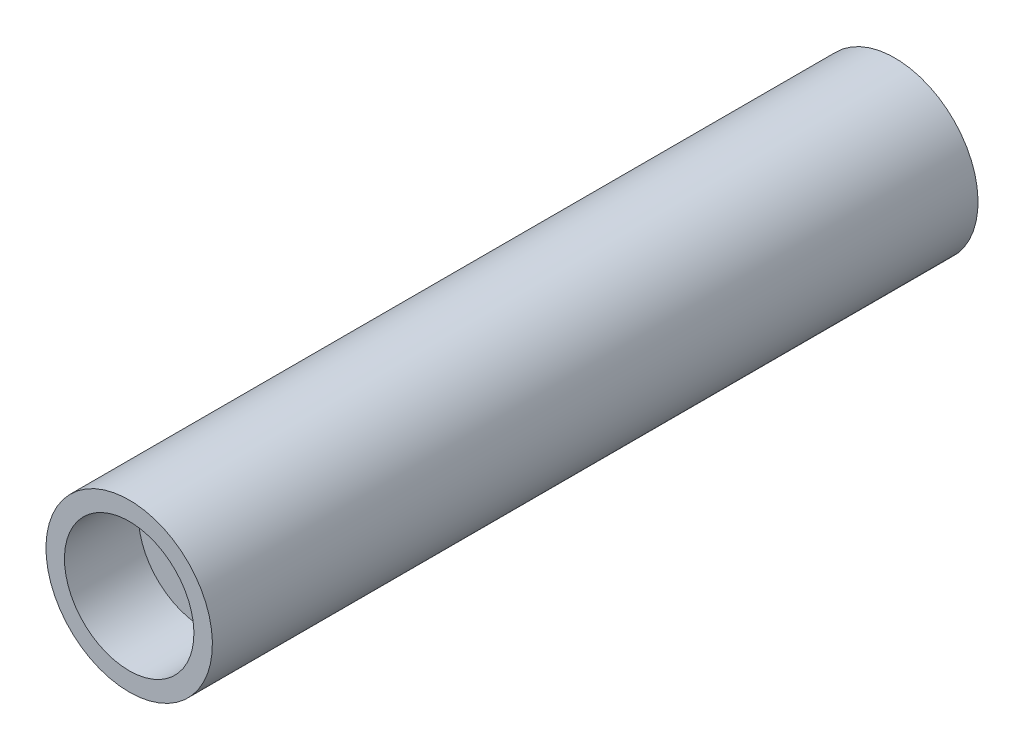
ISO-10303-21;
HEADER;
FILE_DESCRIPTION(('STEP AP214'),'2;1');
FILE_NAME('part.step','',(''),(''),'','','');
FILE_SCHEMA(('AUTOMOTIVE_DESIGN { 1 0 10303 214 1 1 1 1 }'));
ENDSEC;
DATA;
#1=APPLICATION_CONTEXT('core data for automotive mechanical design processes');
#2=APPLICATION_PROTOCOL_DEFINITION('international standard','automotive_design',2000,#1);
#3=PRODUCT_CONTEXT('',#1,'mechanical');
#4=PRODUCT('Part','Part','',(#3));
#5=PRODUCT_RELATED_PRODUCT_CATEGORY('part','',(#4));
#6=PRODUCT_DEFINITION_FORMATION('','',#4);
#7=PRODUCT_DEFINITION_CONTEXT('part definition',#1,'design');
#8=PRODUCT_DEFINITION('design','',#6,#7);
#9=PRODUCT_DEFINITION_SHAPE('','',#8);
#10=(LENGTH_UNIT() NAMED_UNIT(*) SI_UNIT(.MILLI.,.METRE.));
#11=(NAMED_UNIT(*) PLANE_ANGLE_UNIT() SI_UNIT($,.RADIAN.));
#12=(NAMED_UNIT(*) SI_UNIT($,.STERADIAN.) SOLID_ANGLE_UNIT());
#13=UNCERTAINTY_MEASURE_WITH_UNIT(LENGTH_MEASURE(1.E-05),#10,'distance_accuracy_value','');
#14=(GEOMETRIC_REPRESENTATION_CONTEXT(3) GLOBAL_UNCERTAINTY_ASSIGNED_CONTEXT((#13)) GLOBAL_UNIT_ASSIGNED_CONTEXT((#10,
#11,#12)) REPRESENTATION_CONTEXT('',''));
#15=CARTESIAN_POINT('',(0.,0.,0.));
#16=DIRECTION('',(0.,0.,1.));
#17=DIRECTION('',(1.,0.,0.));
#18=AXIS2_PLACEMENT_3D('',#15,#16,#17);
#19=CARTESIAN_POINT('',(0.,4.5,-20.7));
#20=DIRECTION('',(0.,0.,1.));
#21=DIRECTION('',(0.,-1.,0.));
#22=AXIS2_PLACEMENT_3D('',#19,#20,#21);
#23=PLANE('',#22);
#24=CARTESIAN_POINT('',(0.,0.,-20.7));
#25=DIRECTION('',(0.,0.,1.));
#26=DIRECTION('',(0.,-1.,0.));
#27=AXIS2_PLACEMENT_3D('',#24,#25,#26);
#28=CIRCLE('',#27,4.5);
#29=CARTESIAN_POINT('',(0.,-4.49999999999999,-20.7));
#30=VERTEX_POINT('',#29);
#31=EDGE_CURVE('E10',#30,#30,#28,.T.);
#32=ORIENTED_EDGE('',*,*,#31,.F.);
#33=EDGE_LOOP('',(#32));
#34=FACE_BOUND('',#33,.T.);
#35=CARTESIAN_POINT('',(0.,0.,-20.7));
#36=DIRECTION('',(0.,0.,1.));
#37=DIRECTION('',(0.,-1.,0.));
#38=AXIS2_PLACEMENT_3D('',#35,#36,#37);
#39=CIRCLE('',#38,3.49999999999999);
#40=CARTESIAN_POINT('',(0.,-3.49999999999999,-20.7));
#41=VERTEX_POINT('',#40);
#42=EDGE_CURVE('E58',#41,#41,#39,.T.);
#43=ORIENTED_EDGE('',*,*,#42,.T.);
#44=EDGE_LOOP('',(#43));
#45=FACE_BOUND('',#44,.T.);
#46=ADVANCED_FACE('F30',(#34,#45),#23,.F.);
#47=CARTESIAN_POINT('',(0.,0.,16.9300479337721));
#48=DIRECTION('',(0.,0.,1.));
#49=DIRECTION('',(0.,-1.,0.));
#50=AXIS2_PLACEMENT_3D('',#47,#48,#49);
#51=CYLINDRICAL_SURFACE('',#50,4.5);
#52=CARTESIAN_POINT('',(0.,0.,20.7));
#53=DIRECTION('',(0.,0.,1.));
#54=DIRECTION('',(0.,-1.,0.));
#55=AXIS2_PLACEMENT_3D('',#52,#53,#54);
#56=CIRCLE('',#55,4.5);
#57=CARTESIAN_POINT('',(0.,-4.5,20.7));
#58=VERTEX_POINT('',#57);
#59=EDGE_CURVE('E36',#58,#58,#56,.T.);
#60=ORIENTED_EDGE('',*,*,#59,.F.);
#61=EDGE_LOOP('',(#60));
#62=FACE_BOUND('',#61,.T.);
#63=ORIENTED_EDGE('',*,*,#31,.T.);
#64=EDGE_LOOP('',(#63));
#65=FACE_BOUND('',#64,.T.);
#66=ADVANCED_FACE('F95',(#62,#65),#51,.T.);
#67=CARTESIAN_POINT('',(0.,4.5,20.7));
#68=DIRECTION('',(0.,0.,-1.));
#69=DIRECTION('',(0.,1.,0.));
#70=AXIS2_PLACEMENT_3D('',#67,#68,#69);
#71=PLANE('',#70);
#72=CARTESIAN_POINT('',(0.,0.,20.7));
#73=DIRECTION('',(0.,0.,1.));
#74=DIRECTION('',(0.,-1.,0.));
#75=AXIS2_PLACEMENT_3D('',#72,#73,#74);
#76=CIRCLE('',#75,3.5);
#77=CARTESIAN_POINT('',(0.,-3.5,20.7));
#78=VERTEX_POINT('',#77);
#79=EDGE_CURVE('E40',#78,#78,#76,.T.);
#80=ORIENTED_EDGE('',*,*,#79,.F.);
#81=EDGE_LOOP('',(#80));
#82=FACE_BOUND('',#81,.T.);
#83=ORIENTED_EDGE('',*,*,#59,.T.);
#84=EDGE_LOOP('',(#83));
#85=FACE_BOUND('',#84,.T.);
#86=ADVANCED_FACE('F90',(#82,#85),#71,.F.);
#87=CARTESIAN_POINT('',(0.,0.,16.9300479337721));
#88=DIRECTION('',(0.,0.,1.));
#89=DIRECTION('',(0.,-1.,0.));
#90=AXIS2_PLACEMENT_3D('',#87,#88,#89);
#91=CYLINDRICAL_SURFACE('',#90,3.5);
#92=CARTESIAN_POINT('',(0.,0.,16.7));
#93=DIRECTION('',(0.,0.,1.));
#94=DIRECTION('',(0.,-1.,0.));
#95=AXIS2_PLACEMENT_3D('',#92,#93,#94);
#96=CIRCLE('',#95,3.5);
#97=CARTESIAN_POINT('',(0.,-3.5,16.7));
#98=VERTEX_POINT('',#97);
#99=EDGE_CURVE('E44',#98,#98,#96,.T.);
#100=ORIENTED_EDGE('',*,*,#99,.F.);
#101=EDGE_LOOP('',(#100));
#102=FACE_BOUND('',#101,.T.);
#103=ORIENTED_EDGE('',*,*,#79,.T.);
#104=EDGE_LOOP('',(#103));
#105=FACE_BOUND('',#104,.T.);
#106=ADVANCED_FACE('F84',(#102,#105),#91,.F.);
#107=CARTESIAN_POINT('',(0.,3.5,16.7));
#108=DIRECTION('',(0.,0.,-1.));
#109=DIRECTION('',(0.,1.,0.));
#110=AXIS2_PLACEMENT_3D('',#107,#108,#109);
#111=PLANE('',#110);
#112=CARTESIAN_POINT('',(0.,0.,16.7));
#113=DIRECTION('',(0.,0.,1.));
#114=DIRECTION('',(0.,-1.,0.));
#115=AXIS2_PLACEMENT_3D('',#112,#113,#114);
#116=CIRCLE('',#115,2.);
#117=CARTESIAN_POINT('',(0.,-2.,16.7));
#118=VERTEX_POINT('',#117);
#119=EDGE_CURVE('E49',#118,#118,#116,.T.);
#120=ORIENTED_EDGE('',*,*,#119,.F.);
#121=EDGE_LOOP('',(#120));
#122=FACE_BOUND('',#121,.T.);
#123=ORIENTED_EDGE('',*,*,#99,.T.);
#124=EDGE_LOOP('',(#123));
#125=FACE_BOUND('',#124,.T.);
#126=ADVANCED_FACE('F78',(#122,#125),#111,.F.);
#127=CARTESIAN_POINT('',(0.,0.,16.9300479337721));
#128=DIRECTION('',(0.,0.,1.));
#129=DIRECTION('',(0.,-1.,0.));
#130=AXIS2_PLACEMENT_3D('',#127,#128,#129);
#131=CYLINDRICAL_SURFACE('',#130,2.);
#132=CARTESIAN_POINT('',(0.,0.,-16.7));
#133=DIRECTION('',(0.,0.,1.));
#134=DIRECTION('',(0.,-1.,0.));
#135=AXIS2_PLACEMENT_3D('',#132,#133,#134);
#136=CIRCLE('',#135,1.99999999999999);
#137=CARTESIAN_POINT('',(0.,-1.99999999999999,-16.7));
#138=VERTEX_POINT('',#137);
#139=EDGE_CURVE('E52',#138,#138,#136,.T.);
#140=ORIENTED_EDGE('',*,*,#139,.F.);
#141=EDGE_LOOP('',(#140));
#142=FACE_BOUND('',#141,.T.);
#143=ORIENTED_EDGE('',*,*,#119,.T.);
#144=EDGE_LOOP('',(#143));
#145=FACE_BOUND('',#144,.T.);
#146=ADVANCED_FACE('F72',(#142,#145),#131,.F.);
#147=CARTESIAN_POINT('',(0.,3.5,-16.7));
#148=DIRECTION('',(0.,0.,1.));
#149=DIRECTION('',(0.,-1.,0.));
#150=AXIS2_PLACEMENT_3D('',#147,#148,#149);
#151=PLANE('',#150);
#152=CARTESIAN_POINT('',(0.,0.,-16.7));
#153=DIRECTION('',(0.,0.,1.));
#154=DIRECTION('',(0.,-1.,0.));
#155=AXIS2_PLACEMENT_3D('',#152,#153,#154);
#156=CIRCLE('',#155,3.5);
#157=CARTESIAN_POINT('',(0.,-3.49999999999999,-16.7));
#158=VERTEX_POINT('',#157);
#159=EDGE_CURVE('E55',#158,#158,#156,.T.);
#160=ORIENTED_EDGE('',*,*,#159,.F.);
#161=EDGE_LOOP('',(#160));
#162=FACE_BOUND('',#161,.T.);
#163=ORIENTED_EDGE('',*,*,#139,.T.);
#164=EDGE_LOOP('',(#163));
#165=FACE_BOUND('',#164,.T.);
#166=ADVANCED_FACE('F66',(#162,#165),#151,.F.);
#167=CARTESIAN_POINT('',(0.,0.,16.9300479337721));
#168=DIRECTION('',(0.,0.,1.));
#169=DIRECTION('',(0.,-1.,0.));
#170=AXIS2_PLACEMENT_3D('',#167,#168,#169);
#171=CYLINDRICAL_SURFACE('',#170,3.5);
#172=ORIENTED_EDGE('',*,*,#42,.F.);
#173=EDGE_LOOP('',(#172));
#174=FACE_BOUND('',#173,.T.);
#175=ORIENTED_EDGE('',*,*,#159,.T.);
#176=EDGE_LOOP('',(#175));
#177=FACE_BOUND('',#176,.T.);
#178=ADVANCED_FACE('F63',(#174,#177),#171,.F.);
#179=CLOSED_SHELL('',(#46,#66,#86,#106,#126,#146,#166,#178));
#180=MANIFOLD_SOLID_BREP('B2',#179);
#181=ADVANCED_BREP_SHAPE_REPRESENTATION('',(#18,#180),#14);
#182=SHAPE_DEFINITION_REPRESENTATION(#9,#181);
ENDSEC;
END-ISO-10303-21;
